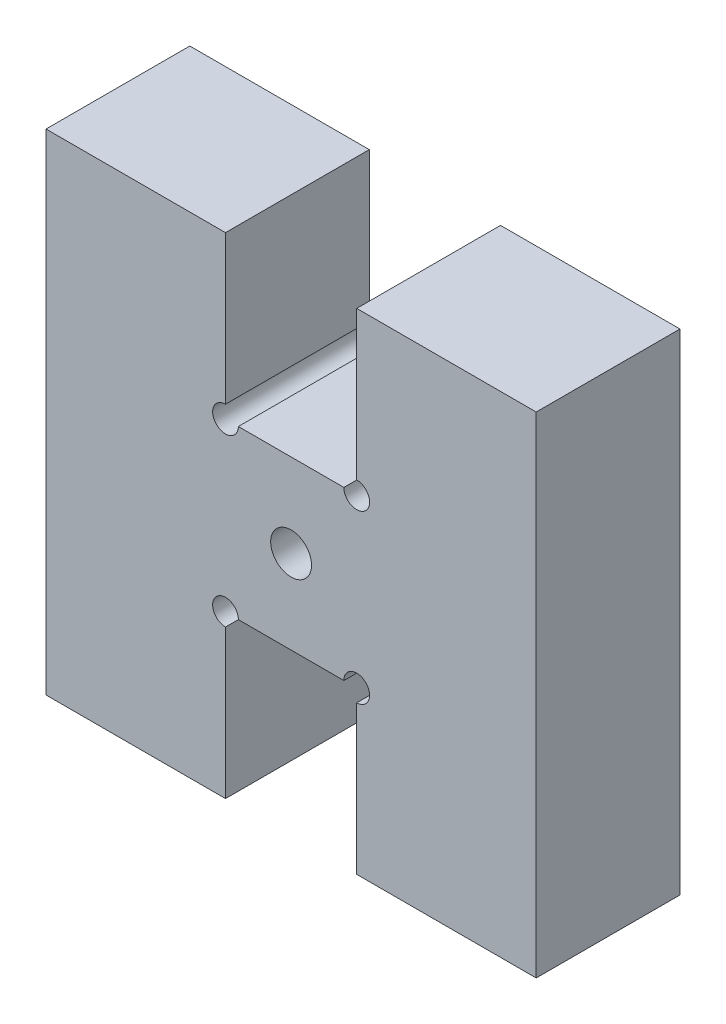
ISO-10303-21;
HEADER;
FILE_DESCRIPTION(('STEP AP214'),'2;1');
FILE_NAME('part.step','',(''),(''),'','','');
FILE_SCHEMA(('AUTOMOTIVE_DESIGN { 1 0 10303 214 1 1 1 1 }'));
ENDSEC;
DATA;
#1=APPLICATION_CONTEXT('core data for automotive mechanical design processes');
#2=APPLICATION_PROTOCOL_DEFINITION('international standard','automotive_design',2000,#1);
#3=PRODUCT_CONTEXT('',#1,'mechanical');
#4=PRODUCT('Part','Part','',(#3));
#5=PRODUCT_RELATED_PRODUCT_CATEGORY('part','',(#4));
#6=PRODUCT_DEFINITION_FORMATION('','',#4);
#7=PRODUCT_DEFINITION_CONTEXT('part definition',#1,'design');
#8=PRODUCT_DEFINITION('design','',#6,#7);
#9=PRODUCT_DEFINITION_SHAPE('','',#8);
#10=(LENGTH_UNIT() NAMED_UNIT(*) SI_UNIT(.MILLI.,.METRE.));
#11=(NAMED_UNIT(*) PLANE_ANGLE_UNIT() SI_UNIT($,.RADIAN.));
#12=(NAMED_UNIT(*) SI_UNIT($,.STERADIAN.) SOLID_ANGLE_UNIT());
#13=UNCERTAINTY_MEASURE_WITH_UNIT(LENGTH_MEASURE(1.E-05),#10,'distance_accuracy_value','');
#14=(GEOMETRIC_REPRESENTATION_CONTEXT(3) GLOBAL_UNCERTAINTY_ASSIGNED_CONTEXT((#13)) GLOBAL_UNIT_ASSIGNED_CONTEXT((#10,
#11,#12)) REPRESENTATION_CONTEXT('',''));
#15=CARTESIAN_POINT('',(0.,0.,0.));
#16=DIRECTION('',(0.,0.,1.));
#17=DIRECTION('',(1.,0.,0.));
#18=AXIS2_PLACEMENT_3D('',#15,#16,#17);
#19=CARTESIAN_POINT('',(-2.55,3.25,5.588));
#20=DIRECTION('',(0.,-1.,0.));
#21=DIRECTION('',(0.,0.,-1.));
#22=AXIS2_PLACEMENT_3D('',#19,#20,#21);
#23=PLANE('',#22);
#24=DIRECTION('',(0.,0.,-1.));
#25=VECTOR('',#24,1.);
#26=CARTESIAN_POINT('',(2.05,3.25,5.588));
#27=LINE('',#26,#25);
#28=CARTESIAN_POINT('',(2.05,3.25,0.));
#29=VERTEX_POINT('',#28);
#30=CARTESIAN_POINT('',(2.05,3.25,5.588));
#31=VERTEX_POINT('',#30);
#32=EDGE_CURVE('E143',#29,#31,#27,.F.);
#33=ORIENTED_EDGE('',*,*,#32,.F.);
#34=DIRECTION('',(-1.,0.,0.));
#35=VECTOR('',#34,1.);
#36=CARTESIAN_POINT('',(-2.55,3.25,0.));
#37=LINE('',#36,#35);
#38=CARTESIAN_POINT('',(-2.05,3.25,0.));
#39=VERTEX_POINT('',#38);
#40=EDGE_CURVE('E204',#29,#39,#37,.T.);
#41=ORIENTED_EDGE('',*,*,#40,.T.);
#42=DIRECTION('',(0.,0.,-1.));
#43=VECTOR('',#42,1.);
#44=CARTESIAN_POINT('',(-2.05,3.25,5.588));
#45=LINE('',#44,#43);
#46=CARTESIAN_POINT('',(-2.05,3.25,5.588));
#47=VERTEX_POINT('',#46);
#48=EDGE_CURVE('E170',#47,#39,#45,.T.);
#49=ORIENTED_EDGE('',*,*,#48,.F.);
#50=DIRECTION('',(-1.,0.,0.));
#51=VECTOR('',#50,1.);
#52=CARTESIAN_POINT('',(-2.55,3.25,5.588));
#53=LINE('',#52,#51);
#54=EDGE_CURVE('E163',#31,#47,#53,.T.);
#55=ORIENTED_EDGE('',*,*,#54,.F.);
#56=EDGE_LOOP('',(#33,#41,#49,#55));
#57=FACE_BOUND('',#56,.T.);
#58=ADVANCED_FACE('F33',(#57),#23,.F.);
#59=CARTESIAN_POINT('',(-2.55,3.25,5.588));
#60=DIRECTION('',(-1.,0.,0.));
#61=DIRECTION('',(0.,-1.,0.));
#62=AXIS2_PLACEMENT_3D('',#59,#60,#61);
#63=PLANE('',#62);
#64=DIRECTION('',(0.,0.,-1.));
#65=VECTOR('',#64,1.);
#66=CARTESIAN_POINT('',(-2.55,3.75,5.588));
#67=LINE('',#66,#65);
#68=CARTESIAN_POINT('',(-2.55,3.75,0.));
#69=VERTEX_POINT('',#68);
#70=CARTESIAN_POINT('',(-2.55,3.75,5.588));
#71=VERTEX_POINT('',#70);
#72=EDGE_CURVE('E11',#69,#71,#67,.F.);
#73=ORIENTED_EDGE('',*,*,#72,.F.);
#74=DIRECTION('',(0.,1.,0.));
#75=VECTOR('',#74,1.);
#76=CARTESIAN_POINT('',(-2.55,3.25,0.));
#77=LINE('',#76,#75);
#78=CARTESIAN_POINT('',(-2.55,9.525,0.));
#79=VERTEX_POINT('',#78);
#80=EDGE_CURVE('E206',#69,#79,#77,.T.);
#81=ORIENTED_EDGE('',*,*,#80,.T.);
#82=DIRECTION('',(0.,0.,-1.));
#83=VECTOR('',#82,1.);
#84=CARTESIAN_POINT('',(-2.55,9.525,5.588));
#85=LINE('',#84,#83);
#86=CARTESIAN_POINT('',(-2.55,9.525,5.588));
#87=VERTEX_POINT('',#86);
#88=EDGE_CURVE('E248',#87,#79,#85,.T.);
#89=ORIENTED_EDGE('',*,*,#88,.F.);
#90=DIRECTION('',(0.,1.,0.));
#91=VECTOR('',#90,1.);
#92=CARTESIAN_POINT('',(-2.55,3.25,5.588));
#93=LINE('',#92,#91);
#94=EDGE_CURVE('E171',#71,#87,#93,.T.);
#95=ORIENTED_EDGE('',*,*,#94,.F.);
#96=EDGE_LOOP('',(#73,#81,#89,#95));
#97=FACE_BOUND('',#96,.T.);
#98=ADVANCED_FACE('F299',(#97),#63,.F.);
#99=CARTESIAN_POINT('',(-2.55,-9.525,5.588));
#100=DIRECTION('',(-1.,0.,0.));
#101=DIRECTION('',(0.,-1.,0.));
#102=AXIS2_PLACEMENT_3D('',#99,#100,#101);
#103=PLANE('',#102);
#104=DIRECTION('',(0.,0.,-1.));
#105=VECTOR('',#104,1.);
#106=CARTESIAN_POINT('',(-2.55,-3.75,5.588));
#107=LINE('',#106,#105);
#108=CARTESIAN_POINT('',(-2.55,-3.75,5.588));
#109=VERTEX_POINT('',#108);
#110=CARTESIAN_POINT('',(-2.55,-3.75,0.));
#111=VERTEX_POINT('',#110);
#112=EDGE_CURVE('E269',#109,#111,#107,.T.);
#113=ORIENTED_EDGE('',*,*,#112,.F.);
#114=DIRECTION('',(0.,1.,0.));
#115=VECTOR('',#114,1.);
#116=CARTESIAN_POINT('',(-2.55,-9.525,5.588));
#117=LINE('',#116,#115);
#118=CARTESIAN_POINT('',(-2.55,-9.525,5.588));
#119=VERTEX_POINT('',#118);
#120=EDGE_CURVE('E188',#119,#109,#117,.T.);
#121=ORIENTED_EDGE('',*,*,#120,.F.);
#122=DIRECTION('',(0.,0.,-1.));
#123=VECTOR('',#122,1.);
#124=CARTESIAN_POINT('',(-2.55,-9.525,5.588));
#125=LINE('',#124,#123);
#126=CARTESIAN_POINT('',(-2.55,-9.525,0.));
#127=VERTEX_POINT('',#126);
#128=EDGE_CURVE('E239',#119,#127,#125,.T.);
#129=ORIENTED_EDGE('',*,*,#128,.T.);
#130=DIRECTION('',(0.,1.,0.));
#131=VECTOR('',#130,1.);
#132=CARTESIAN_POINT('',(-2.55,-9.525,0.));
#133=LINE('',#132,#131);
#134=EDGE_CURVE('E215',#127,#111,#133,.T.);
#135=ORIENTED_EDGE('',*,*,#134,.T.);
#136=EDGE_LOOP('',(#113,#121,#129,#135));
#137=FACE_BOUND('',#136,.T.);
#138=ADVANCED_FACE('F303',(#137),#103,.F.);
#139=CARTESIAN_POINT('',(-2.55,-3.25,5.588));
#140=DIRECTION('',(0.,1.,0.));
#141=DIRECTION('',(0.,0.,1.));
#142=AXIS2_PLACEMENT_3D('',#139,#140,#141);
#143=PLANE('',#142);
#144=DIRECTION('',(0.,0.,-1.));
#145=VECTOR('',#144,1.);
#146=CARTESIAN_POINT('',(-2.05,-3.25,5.588));
#147=LINE('',#146,#145);
#148=CARTESIAN_POINT('',(-2.05,-3.25,0.));
#149=VERTEX_POINT('',#148);
#150=CARTESIAN_POINT('',(-2.05,-3.25,5.588));
#151=VERTEX_POINT('',#150);
#152=EDGE_CURVE('E40',#149,#151,#147,.F.);
#153=ORIENTED_EDGE('',*,*,#152,.F.);
#154=DIRECTION('',(1.,0.,0.));
#155=VECTOR('',#154,1.);
#156=CARTESIAN_POINT('',(-2.55,-3.25,0.));
#157=LINE('',#156,#155);
#158=CARTESIAN_POINT('',(2.05,-3.25,0.));
#159=VERTEX_POINT('',#158);
#160=EDGE_CURVE('E218',#149,#159,#157,.T.);
#161=ORIENTED_EDGE('',*,*,#160,.T.);
#162=DIRECTION('',(0.,0.,-1.));
#163=VECTOR('',#162,1.);
#164=CARTESIAN_POINT('',(2.05,-3.25,5.588));
#165=LINE('',#164,#163);
#166=CARTESIAN_POINT('',(2.05,-3.25,5.588));
#167=VERTEX_POINT('',#166);
#168=EDGE_CURVE('E265',#167,#159,#165,.T.);
#169=ORIENTED_EDGE('',*,*,#168,.F.);
#170=DIRECTION('',(1.,0.,0.));
#171=VECTOR('',#170,1.);
#172=CARTESIAN_POINT('',(-2.55,-3.25,5.588));
#173=LINE('',#172,#171);
#174=EDGE_CURVE('E191',#151,#167,#173,.T.);
#175=ORIENTED_EDGE('',*,*,#174,.F.);
#176=EDGE_LOOP('',(#153,#161,#169,#175));
#177=FACE_BOUND('',#176,.T.);
#178=ADVANCED_FACE('F264',(#177),#143,.F.);
#179=CARTESIAN_POINT('',(2.55,-3.25,5.588));
#180=DIRECTION('',(1.,0.,0.));
#181=DIRECTION('',(0.,1.,0.));
#182=AXIS2_PLACEMENT_3D('',#179,#180,#181);
#183=PLANE('',#182);
#184=DIRECTION('',(0.,0.,-1.));
#185=VECTOR('',#184,1.);
#186=CARTESIAN_POINT('',(2.55,-3.75,5.588));
#187=LINE('',#186,#185);
#188=CARTESIAN_POINT('',(2.55,-3.75,0.));
#189=VERTEX_POINT('',#188);
#190=CARTESIAN_POINT('',(2.55,-3.75,5.588));
#191=VERTEX_POINT('',#190);
#192=EDGE_CURVE('E253',#189,#191,#187,.F.);
#193=ORIENTED_EDGE('',*,*,#192,.F.);
#194=DIRECTION('',(0.,-1.,0.));
#195=VECTOR('',#194,1.);
#196=CARTESIAN_POINT('',(2.55,-3.25,0.));
#197=LINE('',#196,#195);
#198=CARTESIAN_POINT('',(2.55,-9.525,0.));
#199=VERTEX_POINT('',#198);
#200=EDGE_CURVE('E221',#189,#199,#197,.T.);
#201=ORIENTED_EDGE('',*,*,#200,.T.);
#202=DIRECTION('',(0.,0.,-1.));
#203=VECTOR('',#202,1.);
#204=CARTESIAN_POINT('',(2.55,-9.525,5.588));
#205=LINE('',#204,#203);
#206=CARTESIAN_POINT('',(2.55,-9.525,5.588));
#207=VERTEX_POINT('',#206);
#208=EDGE_CURVE('E236',#207,#199,#205,.T.);
#209=ORIENTED_EDGE('',*,*,#208,.F.);
#210=DIRECTION('',(0.,-1.,0.));
#211=VECTOR('',#210,1.);
#212=CARTESIAN_POINT('',(2.55,-3.25,5.588));
#213=LINE('',#212,#211);
#214=EDGE_CURVE('E194',#191,#207,#213,.T.);
#215=ORIENTED_EDGE('',*,*,#214,.F.);
#216=EDGE_LOOP('',(#193,#201,#209,#215));
#217=FACE_BOUND('',#216,.T.);
#218=ADVANCED_FACE('F326',(#217),#183,.F.);
#219=CARTESIAN_POINT('',(2.55,9.525,5.588));
#220=DIRECTION('',(1.,0.,0.));
#221=DIRECTION('',(0.,1.,0.));
#222=AXIS2_PLACEMENT_3D('',#219,#220,#221);
#223=PLANE('',#222);
#224=DIRECTION('',(0.,0.,-1.));
#225=VECTOR('',#224,1.);
#226=CARTESIAN_POINT('',(2.55,3.75,5.588));
#227=LINE('',#226,#225);
#228=CARTESIAN_POINT('',(2.55,3.75,5.588));
#229=VERTEX_POINT('',#228);
#230=CARTESIAN_POINT('',(2.55,3.75,0.));
#231=VERTEX_POINT('',#230);
#232=EDGE_CURVE('E251',#229,#231,#227,.T.);
#233=ORIENTED_EDGE('',*,*,#232,.F.);
#234=DIRECTION('',(0.,-1.,0.));
#235=VECTOR('',#234,1.);
#236=CARTESIAN_POINT('',(2.55,9.525,5.588));
#237=LINE('',#236,#235);
#238=CARTESIAN_POINT('',(2.55,9.525,5.588));
#239=VERTEX_POINT('',#238);
#240=EDGE_CURVE('E165',#239,#229,#237,.T.);
#241=ORIENTED_EDGE('',*,*,#240,.F.);
#242=DIRECTION('',(0.,0.,-1.));
#243=VECTOR('',#242,1.);
#244=CARTESIAN_POINT('',(2.55,9.525,5.588));
#245=LINE('',#244,#243);
#246=CARTESIAN_POINT('',(2.55,9.525,0.));
#247=VERTEX_POINT('',#246);
#248=EDGE_CURVE('E203',#239,#247,#245,.T.);
#249=ORIENTED_EDGE('',*,*,#248,.T.);
#250=DIRECTION('',(0.,-1.,0.));
#251=VECTOR('',#250,1.);
#252=CARTESIAN_POINT('',(2.55,9.525,0.));
#253=LINE('',#252,#251);
#254=EDGE_CURVE('E172',#247,#231,#253,.T.);
#255=ORIENTED_EDGE('',*,*,#254,.T.);
#256=EDGE_LOOP('',(#233,#241,#249,#255));
#257=FACE_BOUND('',#256,.T.);
#258=ADVANCED_FACE('F329',(#257),#223,.F.);
#259=CARTESIAN_POINT('',(0.,0.,5.588));
#260=DIRECTION('',(0.,0.,-1.));
#261=DIRECTION('',(-1.,0.,0.));
#262=AXIS2_PLACEMENT_3D('',#259,#260,#261);
#263=PLANE('',#262);
#264=CARTESIAN_POINT('',(-2.55,-3.25,5.588));
#265=DIRECTION('',(0.,0.,1.));
#266=DIRECTION('',(1.,0.,0.));
#267=AXIS2_PLACEMENT_3D('',#264,#265,#266);
#268=CIRCLE('',#267,0.5);
#269=EDGE_CURVE('E255',#151,#109,#268,.T.);
#270=ORIENTED_EDGE('',*,*,#269,.F.);
#271=ORIENTED_EDGE('',*,*,#174,.T.);
#272=CARTESIAN_POINT('',(2.55,-3.25,5.588));
#273=DIRECTION('',(0.,0.,1.));
#274=DIRECTION('',(1.,0.,0.));
#275=AXIS2_PLACEMENT_3D('',#272,#273,#274);
#276=CIRCLE('',#275,0.5);
#277=EDGE_CURVE('E167',#191,#167,#276,.T.);
#278=ORIENTED_EDGE('',*,*,#277,.F.);
#279=ORIENTED_EDGE('',*,*,#214,.T.);
#280=DIRECTION('',(1.,0.,0.));
#281=VECTOR('',#280,1.);
#282=CARTESIAN_POINT('',(2.55,-9.525,5.588));
#283=LINE('',#282,#281);
#284=CARTESIAN_POINT('',(9.525,-9.525,5.588));
#285=VERTEX_POINT('',#284);
#286=EDGE_CURVE('E196',#207,#285,#283,.T.);
#287=ORIENTED_EDGE('',*,*,#286,.T.);
#288=DIRECTION('',(0.,1.,0.));
#289=VECTOR('',#288,1.);
#290=CARTESIAN_POINT('',(9.525,-9.525,5.588));
#291=LINE('',#290,#289);
#292=CARTESIAN_POINT('',(9.525,9.525,5.588));
#293=VERTEX_POINT('',#292);
#294=EDGE_CURVE('E198',#285,#293,#291,.T.);
#295=ORIENTED_EDGE('',*,*,#294,.T.);
#296=DIRECTION('',(-1.,0.,0.));
#297=VECTOR('',#296,1.);
#298=CARTESIAN_POINT('',(9.525,9.525,5.588));
#299=LINE('',#298,#297);
#300=EDGE_CURVE('E200',#293,#239,#299,.T.);
#301=ORIENTED_EDGE('',*,*,#300,.T.);
#302=ORIENTED_EDGE('',*,*,#240,.T.);
#303=CARTESIAN_POINT('',(2.55,3.25,5.588));
#304=DIRECTION('',(0.,0.,1.));
#305=DIRECTION('',(1.,0.,0.));
#306=AXIS2_PLACEMENT_3D('',#303,#304,#305);
#307=CIRCLE('',#306,0.5);
#308=EDGE_CURVE('E146',#31,#229,#307,.T.);
#309=ORIENTED_EDGE('',*,*,#308,.F.);
#310=ORIENTED_EDGE('',*,*,#54,.T.);
#311=CARTESIAN_POINT('',(-2.55,3.25,5.588));
#312=DIRECTION('',(0.,0.,1.));
#313=DIRECTION('',(1.,0.,0.));
#314=AXIS2_PLACEMENT_3D('',#311,#312,#313);
#315=CIRCLE('',#314,0.5);
#316=EDGE_CURVE('E166',#71,#47,#315,.T.);
#317=ORIENTED_EDGE('',*,*,#316,.F.);
#318=ORIENTED_EDGE('',*,*,#94,.T.);
#319=DIRECTION('',(-1.,0.,0.));
#320=VECTOR('',#319,1.);
#321=CARTESIAN_POINT('',(-2.55,9.525,5.588));
#322=LINE('',#321,#320);
#323=CARTESIAN_POINT('',(-9.525,9.525,5.588));
#324=VERTEX_POINT('',#323);
#325=EDGE_CURVE('E174',#87,#324,#322,.T.);
#326=ORIENTED_EDGE('',*,*,#325,.T.);
#327=DIRECTION('',(0.,-1.,0.));
#328=VECTOR('',#327,1.);
#329=CARTESIAN_POINT('',(-9.525,9.525,5.588));
#330=LINE('',#329,#328);
#331=CARTESIAN_POINT('',(-9.525,-9.525,5.588));
#332=VERTEX_POINT('',#331);
#333=EDGE_CURVE('E184',#324,#332,#330,.T.);
#334=ORIENTED_EDGE('',*,*,#333,.T.);
#335=DIRECTION('',(1.,0.,0.));
#336=VECTOR('',#335,1.);
#337=CARTESIAN_POINT('',(-9.525,-9.525,5.588));
#338=LINE('',#337,#336);
#339=EDGE_CURVE('E186',#332,#119,#338,.T.);
#340=ORIENTED_EDGE('',*,*,#339,.T.);
#341=ORIENTED_EDGE('',*,*,#120,.T.);
#342=EDGE_LOOP('',(#270,#271,#278,#279,#287,#295,#301,#302,#309,#310,#317,#318,#326,#334,#340,#341));
#343=FACE_BOUND('',#342,.T.);
#344=CARTESIAN_POINT('',(0.,0.,5.588));
#345=DIRECTION('',(0.,0.,1.));
#346=DIRECTION('',(1.,0.,0.));
#347=AXIS2_PLACEMENT_3D('',#344,#345,#346);
#348=CIRCLE('',#347,0.79375);
#349=CARTESIAN_POINT('',(0.79375,0.,5.588));
#350=VERTEX_POINT('',#349);
#351=EDGE_CURVE('E207',#350,#350,#348,.T.);
#352=ORIENTED_EDGE('',*,*,#351,.F.);
#353=EDGE_LOOP('',(#352));
#354=FACE_BOUND('',#353,.T.);
#355=ADVANCED_FACE('F160',(#343,#354),#263,.F.);
#356=CARTESIAN_POINT('',(0.,0.,0.));
#357=DIRECTION('',(0.,0.,-1.));
#358=DIRECTION('',(-1.,0.,0.));
#359=AXIS2_PLACEMENT_3D('',#356,#357,#358);
#360=PLANE('',#359);
#361=ORIENTED_EDGE('',*,*,#160,.F.);
#362=CARTESIAN_POINT('',(-2.55,-3.25,0.));
#363=DIRECTION('',(0.,0.,-1.));
#364=DIRECTION('',(-1.,0.,0.));
#365=AXIS2_PLACEMENT_3D('',#362,#363,#364);
#366=CIRCLE('',#365,0.5);
#367=EDGE_CURVE('E54',#149,#111,#366,.F.);
#368=ORIENTED_EDGE('',*,*,#367,.T.);
#369=ORIENTED_EDGE('',*,*,#134,.F.);
#370=DIRECTION('',(1.,0.,0.));
#371=VECTOR('',#370,1.);
#372=CARTESIAN_POINT('',(-9.525,-9.525,0.));
#373=LINE('',#372,#371);
#374=CARTESIAN_POINT('',(-9.525,-9.525,0.));
#375=VERTEX_POINT('',#374);
#376=EDGE_CURVE('E213',#375,#127,#373,.T.);
#377=ORIENTED_EDGE('',*,*,#376,.F.);
#378=DIRECTION('',(0.,-1.,0.));
#379=VECTOR('',#378,1.);
#380=CARTESIAN_POINT('',(-9.525,9.525,0.));
#381=LINE('',#380,#379);
#382=CARTESIAN_POINT('',(-9.525,9.525,0.));
#383=VERTEX_POINT('',#382);
#384=EDGE_CURVE('E211',#383,#375,#381,.T.);
#385=ORIENTED_EDGE('',*,*,#384,.F.);
#386=DIRECTION('',(-1.,0.,0.));
#387=VECTOR('',#386,1.);
#388=CARTESIAN_POINT('',(-2.55,9.525,0.));
#389=LINE('',#388,#387);
#390=EDGE_CURVE('E209',#79,#383,#389,.T.);
#391=ORIENTED_EDGE('',*,*,#390,.F.);
#392=ORIENTED_EDGE('',*,*,#80,.F.);
#393=CARTESIAN_POINT('',(-2.55,3.25,0.));
#394=DIRECTION('',(0.,0.,-1.));
#395=DIRECTION('',(-1.,0.,0.));
#396=AXIS2_PLACEMENT_3D('',#393,#394,#395);
#397=CIRCLE('',#396,0.5);
#398=EDGE_CURVE('E46',#69,#39,#397,.F.);
#399=ORIENTED_EDGE('',*,*,#398,.T.);
#400=ORIENTED_EDGE('',*,*,#40,.F.);
#401=CARTESIAN_POINT('',(2.55,3.25,0.));
#402=DIRECTION('',(0.,0.,-1.));
#403=DIRECTION('',(-1.,0.,0.));
#404=AXIS2_PLACEMENT_3D('',#401,#402,#403);
#405=CIRCLE('',#404,0.5);
#406=EDGE_CURVE('E149',#29,#231,#405,.F.);
#407=ORIENTED_EDGE('',*,*,#406,.T.);
#408=ORIENTED_EDGE('',*,*,#254,.F.);
#409=DIRECTION('',(-1.,0.,0.));
#410=VECTOR('',#409,1.);
#411=CARTESIAN_POINT('',(9.525,9.525,0.));
#412=LINE('',#411,#410);
#413=CARTESIAN_POINT('',(9.525,9.525,0.));
#414=VERTEX_POINT('',#413);
#415=EDGE_CURVE('E177',#414,#247,#412,.T.);
#416=ORIENTED_EDGE('',*,*,#415,.F.);
#417=DIRECTION('',(0.,1.,0.));
#418=VECTOR('',#417,1.);
#419=CARTESIAN_POINT('',(9.525,-9.525,0.));
#420=LINE('',#419,#418);
#421=CARTESIAN_POINT('',(9.525,-9.525,0.));
#422=VERTEX_POINT('',#421);
#423=EDGE_CURVE('E225',#422,#414,#420,.T.);
#424=ORIENTED_EDGE('',*,*,#423,.F.);
#425=DIRECTION('',(1.,0.,0.));
#426=VECTOR('',#425,1.);
#427=CARTESIAN_POINT('',(2.55,-9.525,0.));
#428=LINE('',#427,#426);
#429=EDGE_CURVE('E223',#199,#422,#428,.T.);
#430=ORIENTED_EDGE('',*,*,#429,.F.);
#431=ORIENTED_EDGE('',*,*,#200,.F.);
#432=CARTESIAN_POINT('',(2.55,-3.25,0.));
#433=DIRECTION('',(0.,0.,-1.));
#434=DIRECTION('',(-1.,0.,0.));
#435=AXIS2_PLACEMENT_3D('',#432,#433,#434);
#436=CIRCLE('',#435,0.5);
#437=EDGE_CURVE('E154',#189,#159,#436,.F.);
#438=ORIENTED_EDGE('',*,*,#437,.T.);
#439=EDGE_LOOP('',(#361,#368,#369,#377,#385,#391,#392,#399,#400,#407,#408,#416,#424,#430,#431,#438));
#440=FACE_BOUND('',#439,.T.);
#441=CARTESIAN_POINT('',(0.,0.,0.));
#442=DIRECTION('',(0.,0.,1.));
#443=DIRECTION('',(1.,0.,0.));
#444=AXIS2_PLACEMENT_3D('',#441,#442,#443);
#445=CIRCLE('',#444,0.79375);
#446=CARTESIAN_POINT('',(0.79375,0.,0.));
#447=VERTEX_POINT('',#446);
#448=EDGE_CURVE('E180',#447,#447,#445,.T.);
#449=ORIENTED_EDGE('',*,*,#448,.T.);
#450=EDGE_LOOP('',(#449));
#451=FACE_BOUND('',#450,.T.);
#452=ADVANCED_FACE('F281',(#440,#451),#360,.T.);
#453=CARTESIAN_POINT('',(-2.55,9.525,5.588));
#454=DIRECTION('',(0.,-1.,0.));
#455=DIRECTION('',(1.,0.,0.));
#456=AXIS2_PLACEMENT_3D('',#453,#454,#455);
#457=PLANE('',#456);
#458=ORIENTED_EDGE('',*,*,#390,.T.);
#459=DIRECTION('',(0.,0.,-1.));
#460=VECTOR('',#459,1.);
#461=CARTESIAN_POINT('',(-9.525,9.525,5.588));
#462=LINE('',#461,#460);
#463=EDGE_CURVE('E245',#324,#383,#462,.T.);
#464=ORIENTED_EDGE('',*,*,#463,.F.);
#465=ORIENTED_EDGE('',*,*,#325,.F.);
#466=ORIENTED_EDGE('',*,*,#88,.T.);
#467=EDGE_LOOP('',(#458,#464,#465,#466));
#468=FACE_BOUND('',#467,.T.);
#469=ADVANCED_FACE('F311',(#468),#457,.F.);
#470=CARTESIAN_POINT('',(-9.525,9.525,5.588));
#471=DIRECTION('',(1.,0.,0.));
#472=DIRECTION('',(0.,0.,-1.));
#473=AXIS2_PLACEMENT_3D('',#470,#471,#472);
#474=PLANE('',#473);
#475=ORIENTED_EDGE('',*,*,#384,.T.);
#476=DIRECTION('',(0.,0.,-1.));
#477=VECTOR('',#476,1.);
#478=CARTESIAN_POINT('',(-9.525,-9.525,5.588));
#479=LINE('',#478,#477);
#480=EDGE_CURVE('E242',#332,#375,#479,.T.);
#481=ORIENTED_EDGE('',*,*,#480,.F.);
#482=ORIENTED_EDGE('',*,*,#333,.F.);
#483=ORIENTED_EDGE('',*,*,#463,.T.);
#484=EDGE_LOOP('',(#475,#481,#482,#483));
#485=FACE_BOUND('',#484,.T.);
#486=ADVANCED_FACE('F314',(#485),#474,.F.);
#487=CARTESIAN_POINT('',(-9.525,-9.525,5.588));
#488=DIRECTION('',(0.,1.,0.));
#489=DIRECTION('',(-1.,0.,0.));
#490=AXIS2_PLACEMENT_3D('',#487,#488,#489);
#491=PLANE('',#490);
#492=ORIENTED_EDGE('',*,*,#376,.T.);
#493=ORIENTED_EDGE('',*,*,#128,.F.);
#494=ORIENTED_EDGE('',*,*,#339,.F.);
#495=ORIENTED_EDGE('',*,*,#480,.T.);
#496=EDGE_LOOP('',(#492,#493,#494,#495));
#497=FACE_BOUND('',#496,.T.);
#498=ADVANCED_FACE('F318',(#497),#491,.F.);
#499=CARTESIAN_POINT('',(2.55,-9.525,5.588));
#500=DIRECTION('',(0.,1.,0.));
#501=DIRECTION('',(0.,0.,1.));
#502=AXIS2_PLACEMENT_3D('',#499,#500,#501);
#503=PLANE('',#502);
#504=ORIENTED_EDGE('',*,*,#429,.T.);
#505=DIRECTION('',(0.,0.,-1.));
#506=VECTOR('',#505,1.);
#507=CARTESIAN_POINT('',(9.525,-9.525,5.588));
#508=LINE('',#507,#506);
#509=EDGE_CURVE('E233',#285,#422,#508,.T.);
#510=ORIENTED_EDGE('',*,*,#509,.F.);
#511=ORIENTED_EDGE('',*,*,#286,.F.);
#512=ORIENTED_EDGE('',*,*,#208,.T.);
#513=EDGE_LOOP('',(#504,#510,#511,#512));
#514=FACE_BOUND('',#513,.T.);
#515=ADVANCED_FACE('F321',(#514),#503,.F.);
#516=CARTESIAN_POINT('',(9.525,-9.525,5.588));
#517=DIRECTION('',(-1.,0.,0.));
#518=DIRECTION('',(0.,0.,1.));
#519=AXIS2_PLACEMENT_3D('',#516,#517,#518);
#520=PLANE('',#519);
#521=ORIENTED_EDGE('',*,*,#423,.T.);
#522=DIRECTION('',(0.,0.,-1.));
#523=VECTOR('',#522,1.);
#524=CARTESIAN_POINT('',(9.525,9.525,5.588));
#525=LINE('',#524,#523);
#526=EDGE_CURVE('E230',#293,#414,#525,.T.);
#527=ORIENTED_EDGE('',*,*,#526,.F.);
#528=ORIENTED_EDGE('',*,*,#294,.F.);
#529=ORIENTED_EDGE('',*,*,#509,.T.);
#530=EDGE_LOOP('',(#521,#527,#528,#529));
#531=FACE_BOUND('',#530,.T.);
#532=ADVANCED_FACE('F293',(#531),#520,.F.);
#533=CARTESIAN_POINT('',(9.525,9.525,5.588));
#534=DIRECTION('',(0.,-1.,0.));
#535=DIRECTION('',(0.,0.,-1.));
#536=AXIS2_PLACEMENT_3D('',#533,#534,#535);
#537=PLANE('',#536);
#538=ORIENTED_EDGE('',*,*,#415,.T.);
#539=ORIENTED_EDGE('',*,*,#248,.F.);
#540=ORIENTED_EDGE('',*,*,#300,.F.);
#541=ORIENTED_EDGE('',*,*,#526,.T.);
#542=EDGE_LOOP('',(#538,#539,#540,#541));
#543=FACE_BOUND('',#542,.T.);
#544=ADVANCED_FACE('F285',(#543),#537,.F.);
#545=CARTESIAN_POINT('',(0.,0.,5.588));
#546=DIRECTION('',(0.,0.,-1.));
#547=DIRECTION('',(-1.,0.,0.));
#548=AXIS2_PLACEMENT_3D('',#545,#546,#547);
#549=CYLINDRICAL_SURFACE('',#548,0.79375);
#550=ORIENTED_EDGE('',*,*,#351,.T.);
#551=EDGE_LOOP('',(#550));
#552=FACE_BOUND('',#551,.T.);
#553=ORIENTED_EDGE('',*,*,#448,.F.);
#554=EDGE_LOOP('',(#553));
#555=FACE_BOUND('',#554,.T.);
#556=ADVANCED_FACE('F283',(#552,#555),#549,.F.);
#557=CARTESIAN_POINT('',(2.55,3.25,5.588));
#558=DIRECTION('',(0.,0.,-1.));
#559=DIRECTION('',(-1.,0.,0.));
#560=AXIS2_PLACEMENT_3D('',#557,#558,#559);
#561=CYLINDRICAL_SURFACE('',#560,0.5);
#562=ORIENTED_EDGE('',*,*,#32,.T.);
#563=ORIENTED_EDGE('',*,*,#308,.T.);
#564=ORIENTED_EDGE('',*,*,#232,.T.);
#565=ORIENTED_EDGE('',*,*,#406,.F.);
#566=EDGE_LOOP('',(#562,#563,#564,#565));
#567=FACE_BOUND('',#566,.T.);
#568=ADVANCED_FACE('F145',(#567),#561,.F.);
#569=CARTESIAN_POINT('',(2.55,-3.25,5.588));
#570=DIRECTION('',(0.,0.,-1.));
#571=DIRECTION('',(-1.,0.,0.));
#572=AXIS2_PLACEMENT_3D('',#569,#570,#571);
#573=CYLINDRICAL_SURFACE('',#572,0.5);
#574=ORIENTED_EDGE('',*,*,#168,.T.);
#575=ORIENTED_EDGE('',*,*,#437,.F.);
#576=ORIENTED_EDGE('',*,*,#192,.T.);
#577=ORIENTED_EDGE('',*,*,#277,.T.);
#578=EDGE_LOOP('',(#574,#575,#576,#577));
#579=FACE_BOUND('',#578,.T.);
#580=ADVANCED_FACE('F291',(#579),#573,.F.);
#581=CARTESIAN_POINT('',(-2.55,-3.25,5.588));
#582=DIRECTION('',(0.,0.,-1.));
#583=DIRECTION('',(-1.,0.,0.));
#584=AXIS2_PLACEMENT_3D('',#581,#582,#583);
#585=CYLINDRICAL_SURFACE('',#584,0.5);
#586=ORIENTED_EDGE('',*,*,#112,.T.);
#587=ORIENTED_EDGE('',*,*,#367,.F.);
#588=ORIENTED_EDGE('',*,*,#152,.T.);
#589=ORIENTED_EDGE('',*,*,#269,.T.);
#590=EDGE_LOOP('',(#586,#587,#588,#589));
#591=FACE_BOUND('',#590,.T.);
#592=ADVANCED_FACE('F254',(#591),#585,.F.);
#593=CARTESIAN_POINT('',(-2.55,3.25,5.588));
#594=DIRECTION('',(0.,0.,-1.));
#595=DIRECTION('',(-1.,0.,0.));
#596=AXIS2_PLACEMENT_3D('',#593,#594,#595);
#597=CYLINDRICAL_SURFACE('',#596,0.5);
#598=ORIENTED_EDGE('',*,*,#48,.T.);
#599=ORIENTED_EDGE('',*,*,#398,.F.);
#600=ORIENTED_EDGE('',*,*,#72,.T.);
#601=ORIENTED_EDGE('',*,*,#316,.T.);
#602=EDGE_LOOP('',(#598,#599,#600,#601));
#603=FACE_BOUND('',#602,.T.);
#604=ADVANCED_FACE('F431',(#603),#597,.F.);
#605=CLOSED_SHELL('',(#58,#98,#138,#178,#218,#258,#355,#452,#469,#486,#498,#515,#532,#544,#556,
#568,#580,#592,#604));
#606=MANIFOLD_SOLID_BREP('B2',#605);
#607=ADVANCED_BREP_SHAPE_REPRESENTATION('',(#18,#606),#14);
#608=SHAPE_DEFINITION_REPRESENTATION(#9,#607);
ENDSEC;
END-ISO-10303-21;
